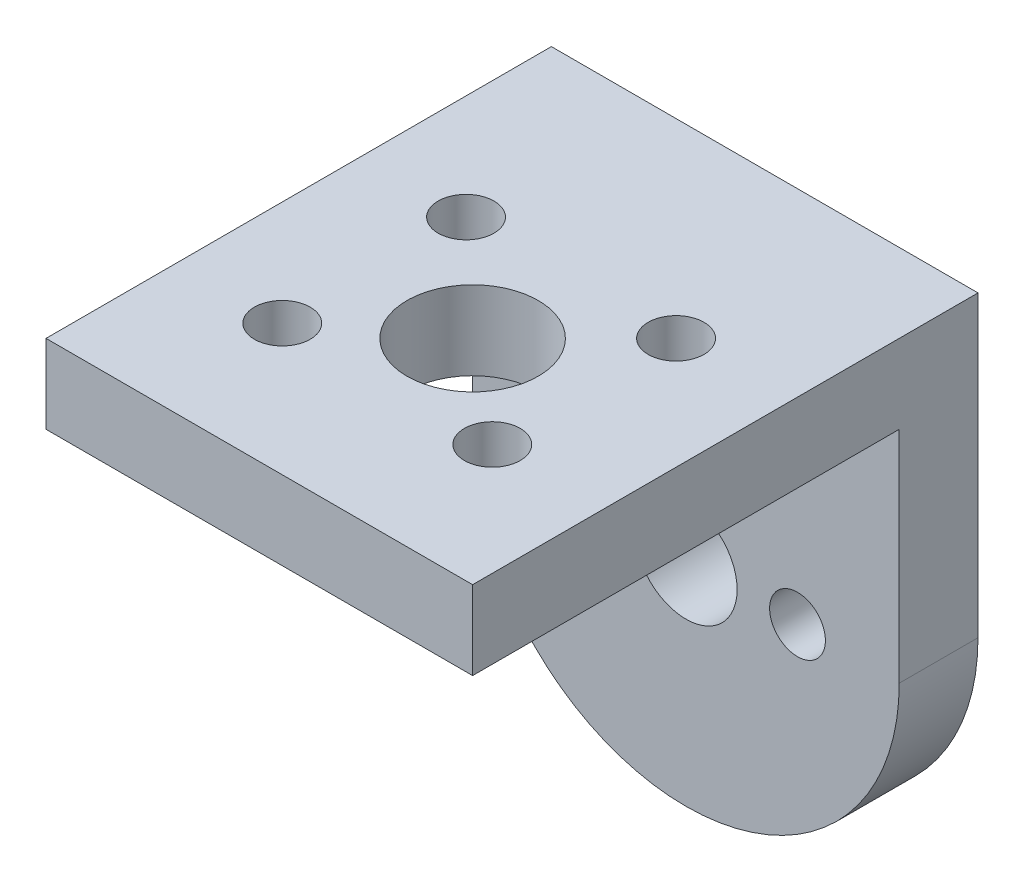
ISO-10303-21;
HEADER;
FILE_DESCRIPTION(('STEP AP214'),'2;1');
FILE_NAME('part.step','',(''),(''),'','','');
FILE_SCHEMA(('AUTOMOTIVE_DESIGN { 1 0 10303 214 1 1 1 1 }'));
ENDSEC;
DATA;
#1=APPLICATION_CONTEXT('core data for automotive mechanical design processes');
#2=APPLICATION_PROTOCOL_DEFINITION('international standard','automotive_design',2000,#1);
#3=PRODUCT_CONTEXT('',#1,'mechanical');
#4=PRODUCT('Part','Part','',(#3));
#5=PRODUCT_RELATED_PRODUCT_CATEGORY('part','',(#4));
#6=PRODUCT_DEFINITION_FORMATION('','',#4);
#7=PRODUCT_DEFINITION_CONTEXT('part definition',#1,'design');
#8=PRODUCT_DEFINITION('design','',#6,#7);
#9=PRODUCT_DEFINITION_SHAPE('','',#8);
#10=(LENGTH_UNIT() NAMED_UNIT(*) SI_UNIT(.MILLI.,.METRE.));
#11=(NAMED_UNIT(*) PLANE_ANGLE_UNIT() SI_UNIT($,.RADIAN.));
#12=(NAMED_UNIT(*) SI_UNIT($,.STERADIAN.) SOLID_ANGLE_UNIT());
#13=UNCERTAINTY_MEASURE_WITH_UNIT(LENGTH_MEASURE(1.E-05),#10,'distance_accuracy_value','');
#14=(GEOMETRIC_REPRESENTATION_CONTEXT(3) GLOBAL_UNCERTAINTY_ASSIGNED_CONTEXT((#13)) GLOBAL_UNIT_ASSIGNED_CONTEXT((#10,
#11,#12)) REPRESENTATION_CONTEXT('',''));
#15=CARTESIAN_POINT('',(0.,0.,0.));
#16=DIRECTION('',(0.,0.,1.));
#17=DIRECTION('',(1.,0.,0.));
#18=AXIS2_PLACEMENT_3D('',#15,#16,#17);
#19=CARTESIAN_POINT('',(0.,-33.,-32.5));
#20=DIRECTION('',(0.,0.,-1.));
#21=DIRECTION('',(-1.,0.,0.));
#22=AXIS2_PLACEMENT_3D('',#19,#20,#21);
#23=PLANE('',#22);
#24=CARTESIAN_POINT('',(7.74999999999999,-16.75,-32.5));
#25=DIRECTION('',(0.,0.,1.));
#26=DIRECTION('',(1.,0.,0.));
#27=AXIS2_PLACEMENT_3D('',#24,#25,#26);
#28=CIRCLE('',#27,2.125);
#29=CARTESIAN_POINT('',(9.87499999999999,-16.75,-32.5));
#30=VERTEX_POINT('',#29);
#31=EDGE_CURVE('E411',#30,#30,#28,.T.);
#32=ORIENTED_EDGE('',*,*,#31,.F.);
#33=EDGE_LOOP('',(#32));
#34=FACE_BOUND('',#33,.T.);
#35=CARTESIAN_POINT('',(24.75,-16.75,-32.5));
#36=DIRECTION('',(0.,0.,1.));
#37=DIRECTION('',(1.,0.,0.));
#38=AXIS2_PLACEMENT_3D('',#35,#36,#37);
#39=CIRCLE('',#38,2.125);
#40=CARTESIAN_POINT('',(26.875,-16.75,-32.5));
#41=VERTEX_POINT('',#40);
#42=EDGE_CURVE('E414',#41,#41,#39,.T.);
#43=ORIENTED_EDGE('',*,*,#42,.F.);
#44=EDGE_LOOP('',(#43));
#45=FACE_BOUND('',#44,.T.);
#46=CARTESIAN_POINT('',(16.25,-16.75,-32.5));
#47=DIRECTION('',(0.,0.,1.));
#48=DIRECTION('',(1.,0.,0.));
#49=AXIS2_PLACEMENT_3D('',#46,#47,#48);
#50=CIRCLE('',#49,3.9);
#51=CARTESIAN_POINT('',(20.15,-16.75,-32.5));
#52=VERTEX_POINT('',#51);
#53=EDGE_CURVE('E141',#52,#52,#50,.T.);
#54=ORIENTED_EDGE('',*,*,#53,.F.);
#55=EDGE_LOOP('',(#54));
#56=FACE_BOUND('',#55,.T.);
#57=DIRECTION('',(0.,1.,0.));
#58=VECTOR('',#57,1.);
#59=CARTESIAN_POINT('',(0.,-33.,-32.5));
#60=LINE('',#59,#58);
#61=CARTESIAN_POINT('',(0.,-16.75,-32.5));
#62=VERTEX_POINT('',#61);
#63=CARTESIAN_POINT('',(0.,0.,-32.5));
#64=VERTEX_POINT('',#63);
#65=EDGE_CURVE('E180',#62,#64,#60,.T.);
#66=ORIENTED_EDGE('',*,*,#65,.F.);
#67=CARTESIAN_POINT('',(16.25,-16.75,-32.5));
#68=DIRECTION('',(0.,0.,1.));
#69=DIRECTION('',(1.,0.,0.));
#70=AXIS2_PLACEMENT_3D('',#67,#68,#69);
#71=CIRCLE('',#70,16.25);
#72=CARTESIAN_POINT('',(32.5,-16.75,-32.5));
#73=VERTEX_POINT('',#72);
#74=EDGE_CURVE('E109',#62,#73,#71,.T.);
#75=ORIENTED_EDGE('',*,*,#74,.T.);
#76=DIRECTION('',(0.,1.,0.));
#77=VECTOR('',#76,1.);
#78=CARTESIAN_POINT('',(32.5,-33.,-32.5));
#79=LINE('',#78,#77);
#80=CARTESIAN_POINT('',(32.5,0.,-32.5));
#81=VERTEX_POINT('',#80);
#82=EDGE_CURVE('E103',#73,#81,#79,.T.);
#83=ORIENTED_EDGE('',*,*,#82,.T.);
#84=DIRECTION('',(-1.,0.,0.));
#85=VECTOR('',#84,1.);
#86=CARTESIAN_POINT('',(0.,0.,-32.5));
#87=LINE('',#86,#85);
#88=EDGE_CURVE('E110',#81,#64,#87,.T.);
#89=ORIENTED_EDGE('',*,*,#88,.T.);
#90=EDGE_LOOP('',(#66,#75,#83,#89));
#91=FACE_BOUND('',#90,.T.);
#92=ADVANCED_FACE('F62',(#34,#45,#56,#91),#23,.F.);
#93=CARTESIAN_POINT('',(0.,-33.,-38.5));
#94=DIRECTION('',(0.,0.,1.));
#95=DIRECTION('',(1.,0.,0.));
#96=AXIS2_PLACEMENT_3D('',#93,#94,#95);
#97=PLANE('',#96);
#98=CARTESIAN_POINT('',(7.74999999999999,-16.75,-38.5));
#99=DIRECTION('',(0.,0.,1.));
#100=DIRECTION('',(1.,0.,0.));
#101=AXIS2_PLACEMENT_3D('',#98,#99,#100);
#102=CIRCLE('',#101,2.125);
#103=CARTESIAN_POINT('',(9.87499999999999,-16.75,-38.5));
#104=VERTEX_POINT('',#103);
#105=EDGE_CURVE('E67',#104,#104,#102,.T.);
#106=ORIENTED_EDGE('',*,*,#105,.T.);
#107=EDGE_LOOP('',(#106));
#108=FACE_BOUND('',#107,.T.);
#109=CARTESIAN_POINT('',(24.75,-16.75,-38.5));
#110=DIRECTION('',(0.,0.,1.));
#111=DIRECTION('',(1.,0.,0.));
#112=AXIS2_PLACEMENT_3D('',#109,#110,#111);
#113=CIRCLE('',#112,2.125);
#114=CARTESIAN_POINT('',(26.875,-16.75,-38.5));
#115=VERTEX_POINT('',#114);
#116=EDGE_CURVE('E142',#115,#115,#113,.T.);
#117=ORIENTED_EDGE('',*,*,#116,.T.);
#118=EDGE_LOOP('',(#117));
#119=FACE_BOUND('',#118,.T.);
#120=CARTESIAN_POINT('',(16.25,-16.75,-38.5));
#121=DIRECTION('',(0.,0.,1.));
#122=DIRECTION('',(1.,0.,0.));
#123=AXIS2_PLACEMENT_3D('',#120,#121,#122);
#124=CIRCLE('',#123,3.9);
#125=CARTESIAN_POINT('',(20.15,-16.75,-38.5));
#126=VERTEX_POINT('',#125);
#127=EDGE_CURVE('E137',#126,#126,#124,.T.);
#128=ORIENTED_EDGE('',*,*,#127,.T.);
#129=EDGE_LOOP('',(#128));
#130=FACE_BOUND('',#129,.T.);
#131=CARTESIAN_POINT('',(16.25,-16.75,-38.5));
#132=DIRECTION('',(0.,0.,1.));
#133=DIRECTION('',(1.,0.,0.));
#134=AXIS2_PLACEMENT_3D('',#131,#132,#133);
#135=CIRCLE('',#134,16.25);
#136=CARTESIAN_POINT('',(0.,-16.75,-38.5));
#137=VERTEX_POINT('',#136);
#138=CARTESIAN_POINT('',(32.5,-16.75,-38.5));
#139=VERTEX_POINT('',#138);
#140=EDGE_CURVE('E168',#137,#139,#135,.T.);
#141=ORIENTED_EDGE('',*,*,#140,.F.);
#142=DIRECTION('',(0.,1.,0.));
#143=VECTOR('',#142,1.);
#144=CARTESIAN_POINT('',(0.,-33.,-38.5));
#145=LINE('',#144,#143);
#146=CARTESIAN_POINT('',(0.,6.,-38.5));
#147=VERTEX_POINT('',#146);
#148=EDGE_CURVE('E182',#137,#147,#145,.T.);
#149=ORIENTED_EDGE('',*,*,#148,.T.);
#150=DIRECTION('',(1.,0.,0.));
#151=VECTOR('',#150,1.);
#152=CARTESIAN_POINT('',(0.,6.,-38.5));
#153=LINE('',#152,#151);
#154=CARTESIAN_POINT('',(32.5,6.,-38.5));
#155=VERTEX_POINT('',#154);
#156=EDGE_CURVE('E113',#147,#155,#153,.T.);
#157=ORIENTED_EDGE('',*,*,#156,.T.);
#158=DIRECTION('',(0.,1.,0.));
#159=VECTOR('',#158,1.);
#160=CARTESIAN_POINT('',(32.5,-33.,-38.5));
#161=LINE('',#160,#159);
#162=EDGE_CURVE('E111',#139,#155,#161,.T.);
#163=ORIENTED_EDGE('',*,*,#162,.F.);
#164=EDGE_LOOP('',(#141,#149,#157,#163));
#165=FACE_BOUND('',#164,.T.);
#166=ADVANCED_FACE('F246',(#108,#119,#130,#165),#97,.F.);
#167=CARTESIAN_POINT('',(32.5,6.,0.));
#168=DIRECTION('',(-1.,0.,0.));
#169=DIRECTION('',(0.,0.,1.));
#170=AXIS2_PLACEMENT_3D('',#167,#168,#169);
#171=PLANE('',#170);
#172=DIRECTION('',(0.,0.,1.));
#173=VECTOR('',#172,1.);
#174=CARTESIAN_POINT('',(32.5,-16.75,-71.5));
#175=LINE('',#174,#173);
#176=EDGE_CURVE('E165',#139,#73,#175,.T.);
#177=ORIENTED_EDGE('',*,*,#176,.F.);
#178=ORIENTED_EDGE('',*,*,#162,.T.);
#179=DIRECTION('',(0.,0.,-1.));
#180=VECTOR('',#179,1.);
#181=CARTESIAN_POINT('',(32.5,6.,0.));
#182=LINE('',#181,#180);
#183=CARTESIAN_POINT('',(32.5,6.,0.));
#184=VERTEX_POINT('',#183);
#185=EDGE_CURVE('E140',#184,#155,#182,.T.);
#186=ORIENTED_EDGE('',*,*,#185,.F.);
#187=DIRECTION('',(0.,-1.,0.));
#188=VECTOR('',#187,1.);
#189=CARTESIAN_POINT('',(32.5,6.,0.));
#190=LINE('',#189,#188);
#191=CARTESIAN_POINT('',(32.5,0.,0.));
#192=VERTEX_POINT('',#191);
#193=EDGE_CURVE('E79',#184,#192,#190,.T.);
#194=ORIENTED_EDGE('',*,*,#193,.T.);
#195=DIRECTION('',(0.,0.,-1.));
#196=VECTOR('',#195,1.);
#197=CARTESIAN_POINT('',(32.5,0.,0.));
#198=LINE('',#197,#196);
#199=EDGE_CURVE('E120',#192,#81,#198,.T.);
#200=ORIENTED_EDGE('',*,*,#199,.T.);
#201=ORIENTED_EDGE('',*,*,#82,.F.);
#202=EDGE_LOOP('',(#177,#178,#186,#194,#200,#201));
#203=FACE_BOUND('',#202,.T.);
#204=ADVANCED_FACE('F118',(#203),#171,.F.);
#205=CARTESIAN_POINT('',(0.,6.,0.));
#206=DIRECTION('',(0.,-1.,0.));
#207=DIRECTION('',(0.,0.,-1.));
#208=AXIS2_PLACEMENT_3D('',#205,#206,#207);
#209=PLANE('',#208);
#210=DIRECTION('',(0.,0.,1.));
#211=VECTOR('',#210,1.);
#212=CARTESIAN_POINT('',(0.,6.,0.));
#213=LINE('',#212,#211);
#214=CARTESIAN_POINT('',(0.,6.,0.));
#215=VERTEX_POINT('',#214);
#216=EDGE_CURVE('E128',#147,#215,#213,.T.);
#217=ORIENTED_EDGE('',*,*,#216,.T.);
#218=DIRECTION('',(1.,0.,0.));
#219=VECTOR('',#218,1.);
#220=CARTESIAN_POINT('',(0.,6.,0.));
#221=LINE('',#220,#219);
#222=EDGE_CURVE('E84',#215,#184,#221,.T.);
#223=ORIENTED_EDGE('',*,*,#222,.T.);
#224=ORIENTED_EDGE('',*,*,#185,.T.);
#225=ORIENTED_EDGE('',*,*,#156,.F.);
#226=EDGE_LOOP('',(#217,#223,#224,#225));
#227=FACE_BOUND('',#226,.T.);
#228=CARTESIAN_POINT('',(24.,6.,-10.));
#229=DIRECTION('',(0.,1.,0.));
#230=DIRECTION('',(0.,0.,1.));
#231=AXIS2_PLACEMENT_3D('',#228,#229,#230);
#232=CIRCLE('',#231,2.125);
#233=CARTESIAN_POINT('',(24.,6.,-7.875));
#234=VERTEX_POINT('',#233);
#235=EDGE_CURVE('E219',#234,#234,#232,.T.);
#236=ORIENTED_EDGE('',*,*,#235,.F.);
#237=EDGE_LOOP('',(#236));
#238=FACE_BOUND('',#237,.T.);
#239=CARTESIAN_POINT('',(24.,6.,-24.));
#240=DIRECTION('',(0.,1.,0.));
#241=DIRECTION('',(0.,0.,1.));
#242=AXIS2_PLACEMENT_3D('',#239,#240,#241);
#243=CIRCLE('',#242,2.125);
#244=CARTESIAN_POINT('',(24.,6.,-21.875));
#245=VERTEX_POINT('',#244);
#246=EDGE_CURVE('E215',#245,#245,#243,.T.);
#247=ORIENTED_EDGE('',*,*,#246,.F.);
#248=EDGE_LOOP('',(#247));
#249=FACE_BOUND('',#248,.T.);
#250=CARTESIAN_POINT('',(8.,6.,-24.));
#251=DIRECTION('',(0.,1.,0.));
#252=DIRECTION('',(0.,0.,1.));
#253=AXIS2_PLACEMENT_3D('',#250,#251,#252);
#254=CIRCLE('',#253,2.125);
#255=CARTESIAN_POINT('',(8.,6.,-21.875));
#256=VERTEX_POINT('',#255);
#257=EDGE_CURVE('E204',#256,#256,#254,.T.);
#258=ORIENTED_EDGE('',*,*,#257,.F.);
#259=EDGE_LOOP('',(#258));
#260=FACE_BOUND('',#259,.T.);
#261=CARTESIAN_POINT('',(8.,6.,-10.));
#262=DIRECTION('',(0.,1.,0.));
#263=DIRECTION('',(0.,0.,1.));
#264=AXIS2_PLACEMENT_3D('',#261,#262,#263);
#265=CIRCLE('',#264,2.125);
#266=CARTESIAN_POINT('',(8.,6.,-7.875));
#267=VERTEX_POINT('',#266);
#268=EDGE_CURVE('E198',#267,#267,#265,.T.);
#269=ORIENTED_EDGE('',*,*,#268,.F.);
#270=EDGE_LOOP('',(#269));
#271=FACE_BOUND('',#270,.T.);
#272=CARTESIAN_POINT('',(16.25,6.,-16.25));
#273=DIRECTION('',(0.,1.,0.));
#274=DIRECTION('',(0.,0.,1.));
#275=AXIS2_PLACEMENT_3D('',#272,#273,#274);
#276=CIRCLE('',#275,5.);
#277=CARTESIAN_POINT('',(16.25,6.,-11.25));
#278=VERTEX_POINT('',#277);
#279=EDGE_CURVE('E190',#278,#278,#276,.T.);
#280=ORIENTED_EDGE('',*,*,#279,.F.);
#281=EDGE_LOOP('',(#280));
#282=FACE_BOUND('',#281,.T.);
#283=ADVANCED_FACE('F253',(#227,#238,#249,#260,#271,#282),#209,.F.);
#284=CARTESIAN_POINT('',(0.,0.,0.));
#285=DIRECTION('',(0.,-1.,0.));
#286=DIRECTION('',(0.,0.,-1.));
#287=AXIS2_PLACEMENT_3D('',#284,#285,#286);
#288=PLANE('',#287);
#289=CARTESIAN_POINT('',(8.,0.,-10.));
#290=DIRECTION('',(0.,1.,0.));
#291=DIRECTION('',(0.,0.,1.));
#292=AXIS2_PLACEMENT_3D('',#289,#290,#291);
#293=CIRCLE('',#292,2.125);
#294=CARTESIAN_POINT('',(8.,0.,-7.875));
#295=VERTEX_POINT('',#294);
#296=EDGE_CURVE('E195',#295,#295,#293,.T.);
#297=ORIENTED_EDGE('',*,*,#296,.T.);
#298=EDGE_LOOP('',(#297));
#299=FACE_BOUND('',#298,.T.);
#300=CARTESIAN_POINT('',(24.,0.,-24.));
#301=DIRECTION('',(0.,1.,0.));
#302=DIRECTION('',(0.,0.,1.));
#303=AXIS2_PLACEMENT_3D('',#300,#301,#302);
#304=CIRCLE('',#303,2.125);
#305=CARTESIAN_POINT('',(24.,0.,-21.875));
#306=VERTEX_POINT('',#305);
#307=EDGE_CURVE('E208',#306,#306,#304,.T.);
#308=ORIENTED_EDGE('',*,*,#307,.T.);
#309=EDGE_LOOP('',(#308));
#310=FACE_BOUND('',#309,.T.);
#311=DIRECTION('',(0.,0.,1.));
#312=VECTOR('',#311,1.);
#313=CARTESIAN_POINT('',(0.,0.,0.));
#314=LINE('',#313,#312);
#315=CARTESIAN_POINT('',(0.,0.,0.));
#316=VERTEX_POINT('',#315);
#317=EDGE_CURVE('E126',#64,#316,#314,.T.);
#318=ORIENTED_EDGE('',*,*,#317,.F.);
#319=ORIENTED_EDGE('',*,*,#88,.F.);
#320=ORIENTED_EDGE('',*,*,#199,.F.);
#321=DIRECTION('',(1.,0.,0.));
#322=VECTOR('',#321,1.);
#323=CARTESIAN_POINT('',(0.,0.,0.));
#324=LINE('',#323,#322);
#325=EDGE_CURVE('E96',#316,#192,#324,.T.);
#326=ORIENTED_EDGE('',*,*,#325,.F.);
#327=EDGE_LOOP('',(#318,#319,#320,#326));
#328=FACE_BOUND('',#327,.T.);
#329=CARTESIAN_POINT('',(24.,0.,-10.));
#330=DIRECTION('',(0.,1.,0.));
#331=DIRECTION('',(0.,0.,1.));
#332=AXIS2_PLACEMENT_3D('',#329,#330,#331);
#333=CIRCLE('',#332,2.125);
#334=CARTESIAN_POINT('',(24.,0.,-7.875));
#335=VERTEX_POINT('',#334);
#336=EDGE_CURVE('E216',#335,#335,#333,.T.);
#337=ORIENTED_EDGE('',*,*,#336,.T.);
#338=EDGE_LOOP('',(#337));
#339=FACE_BOUND('',#338,.T.);
#340=CARTESIAN_POINT('',(8.,0.,-24.));
#341=DIRECTION('',(0.,1.,0.));
#342=DIRECTION('',(0.,0.,1.));
#343=AXIS2_PLACEMENT_3D('',#340,#341,#342);
#344=CIRCLE('',#343,2.125);
#345=CARTESIAN_POINT('',(8.,0.,-21.875));
#346=VERTEX_POINT('',#345);
#347=EDGE_CURVE('E199',#346,#346,#344,.T.);
#348=ORIENTED_EDGE('',*,*,#347,.T.);
#349=EDGE_LOOP('',(#348));
#350=FACE_BOUND('',#349,.T.);
#351=CARTESIAN_POINT('',(16.25,0.,-16.25));
#352=DIRECTION('',(0.,1.,0.));
#353=DIRECTION('',(0.,0.,1.));
#354=AXIS2_PLACEMENT_3D('',#351,#352,#353);
#355=CIRCLE('',#354,5.);
#356=CARTESIAN_POINT('',(16.25,0.,-11.25));
#357=VERTEX_POINT('',#356);
#358=EDGE_CURVE('E179',#357,#357,#355,.T.);
#359=ORIENTED_EDGE('',*,*,#358,.T.);
#360=EDGE_LOOP('',(#359));
#361=FACE_BOUND('',#360,.T.);
#362=ADVANCED_FACE('F124',(#299,#310,#328,#339,#350,#361),#288,.T.);
#363=CARTESIAN_POINT('',(0.,6.,0.));
#364=DIRECTION('',(1.,0.,0.));
#365=DIRECTION('',(0.,0.,-1.));
#366=AXIS2_PLACEMENT_3D('',#363,#364,#365);
#367=PLANE('',#366);
#368=ORIENTED_EDGE('',*,*,#148,.F.);
#369=DIRECTION('',(0.,0.,1.));
#370=VECTOR('',#369,1.);
#371=CARTESIAN_POINT('',(0.,-16.75,-71.5));
#372=LINE('',#371,#370);
#373=EDGE_CURVE('E147',#137,#62,#372,.T.);
#374=ORIENTED_EDGE('',*,*,#373,.T.);
#375=ORIENTED_EDGE('',*,*,#65,.T.);
#376=ORIENTED_EDGE('',*,*,#317,.T.);
#377=DIRECTION('',(0.,-1.,0.));
#378=VECTOR('',#377,1.);
#379=CARTESIAN_POINT('',(0.,6.,0.));
#380=LINE('',#379,#378);
#381=EDGE_CURVE('E12',#215,#316,#380,.T.);
#382=ORIENTED_EDGE('',*,*,#381,.F.);
#383=ORIENTED_EDGE('',*,*,#216,.F.);
#384=EDGE_LOOP('',(#368,#374,#375,#376,#382,#383));
#385=FACE_BOUND('',#384,.T.);
#386=ADVANCED_FACE('F70',(#385),#367,.F.);
#387=CARTESIAN_POINT('',(0.,6.,0.));
#388=DIRECTION('',(0.,0.,-1.));
#389=DIRECTION('',(-1.,0.,0.));
#390=AXIS2_PLACEMENT_3D('',#387,#388,#389);
#391=PLANE('',#390);
#392=ORIENTED_EDGE('',*,*,#325,.T.);
#393=ORIENTED_EDGE('',*,*,#193,.F.);
#394=ORIENTED_EDGE('',*,*,#222,.F.);
#395=ORIENTED_EDGE('',*,*,#381,.T.);
#396=EDGE_LOOP('',(#392,#393,#394,#395));
#397=FACE_BOUND('',#396,.T.);
#398=ADVANCED_FACE('F291',(#397),#391,.F.);
#399=CARTESIAN_POINT('',(24.,6.,-10.));
#400=DIRECTION('',(0.,-1.,0.));
#401=DIRECTION('',(0.,0.,-1.));
#402=AXIS2_PLACEMENT_3D('',#399,#400,#401);
#403=CYLINDRICAL_SURFACE('',#402,2.125);
#404=ORIENTED_EDGE('',*,*,#235,.T.);
#405=EDGE_LOOP('',(#404));
#406=FACE_BOUND('',#405,.T.);
#407=ORIENTED_EDGE('',*,*,#336,.F.);
#408=EDGE_LOOP('',(#407));
#409=FACE_BOUND('',#408,.T.);
#410=ADVANCED_FACE('F287',(#406,#409),#403,.F.);
#411=CARTESIAN_POINT('',(24.,6.,-24.));
#412=DIRECTION('',(0.,-1.,0.));
#413=DIRECTION('',(0.,0.,-1.));
#414=AXIS2_PLACEMENT_3D('',#411,#412,#413);
#415=CYLINDRICAL_SURFACE('',#414,2.125);
#416=ORIENTED_EDGE('',*,*,#246,.T.);
#417=EDGE_LOOP('',(#416));
#418=FACE_BOUND('',#417,.T.);
#419=ORIENTED_EDGE('',*,*,#307,.F.);
#420=EDGE_LOOP('',(#419));
#421=FACE_BOUND('',#420,.T.);
#422=ADVANCED_FACE('F282',(#418,#421),#415,.F.);
#423=CARTESIAN_POINT('',(8.,6.,-24.));
#424=DIRECTION('',(0.,-1.,0.));
#425=DIRECTION('',(0.,0.,-1.));
#426=AXIS2_PLACEMENT_3D('',#423,#424,#425);
#427=CYLINDRICAL_SURFACE('',#426,2.125);
#428=ORIENTED_EDGE('',*,*,#257,.T.);
#429=EDGE_LOOP('',(#428));
#430=FACE_BOUND('',#429,.T.);
#431=ORIENTED_EDGE('',*,*,#347,.F.);
#432=EDGE_LOOP('',(#431));
#433=FACE_BOUND('',#432,.T.);
#434=ADVANCED_FACE('F284',(#430,#433),#427,.F.);
#435=CARTESIAN_POINT('',(8.,6.,-10.));
#436=DIRECTION('',(0.,-1.,0.));
#437=DIRECTION('',(0.,0.,-1.));
#438=AXIS2_PLACEMENT_3D('',#435,#436,#437);
#439=CYLINDRICAL_SURFACE('',#438,2.125);
#440=ORIENTED_EDGE('',*,*,#268,.T.);
#441=EDGE_LOOP('',(#440));
#442=FACE_BOUND('',#441,.T.);
#443=ORIENTED_EDGE('',*,*,#296,.F.);
#444=EDGE_LOOP('',(#443));
#445=FACE_BOUND('',#444,.T.);
#446=ADVANCED_FACE('F270',(#442,#445),#439,.F.);
#447=CARTESIAN_POINT('',(16.25,6.,-16.25));
#448=DIRECTION('',(0.,-1.,0.));
#449=DIRECTION('',(0.,0.,-1.));
#450=AXIS2_PLACEMENT_3D('',#447,#448,#449);
#451=CYLINDRICAL_SURFACE('',#450,5.);
#452=ORIENTED_EDGE('',*,*,#279,.T.);
#453=EDGE_LOOP('',(#452));
#454=FACE_BOUND('',#453,.T.);
#455=ORIENTED_EDGE('',*,*,#358,.F.);
#456=EDGE_LOOP('',(#455));
#457=FACE_BOUND('',#456,.T.);
#458=ADVANCED_FACE('F258',(#454,#457),#451,.F.);
#459=CARTESIAN_POINT('',(16.25,-16.75,-71.5));
#460=DIRECTION('',(0.,0.,1.));
#461=DIRECTION('',(1.,0.,0.));
#462=AXIS2_PLACEMENT_3D('',#459,#460,#461);
#463=CYLINDRICAL_SURFACE('',#462,16.25);
#464=ORIENTED_EDGE('',*,*,#140,.T.);
#465=ORIENTED_EDGE('',*,*,#176,.T.);
#466=ORIENTED_EDGE('',*,*,#74,.F.);
#467=ORIENTED_EDGE('',*,*,#373,.F.);
#468=EDGE_LOOP('',(#464,#465,#466,#467));
#469=FACE_BOUND('',#468,.T.);
#470=ADVANCED_FACE('F251',(#469),#463,.T.);
#471=CARTESIAN_POINT('',(16.25,-16.75,-71.5));
#472=DIRECTION('',(0.,0.,1.));
#473=DIRECTION('',(1.,0.,0.));
#474=AXIS2_PLACEMENT_3D('',#471,#472,#473);
#475=CYLINDRICAL_SURFACE('',#474,3.9);
#476=ORIENTED_EDGE('',*,*,#53,.T.);
#477=EDGE_LOOP('',(#476));
#478=FACE_BOUND('',#477,.T.);
#479=ORIENTED_EDGE('',*,*,#127,.F.);
#480=EDGE_LOOP('',(#479));
#481=FACE_BOUND('',#480,.T.);
#482=ADVANCED_FACE('F254',(#478,#481),#475,.F.);
#483=CARTESIAN_POINT('',(24.75,-16.75,-71.5));
#484=DIRECTION('',(0.,0.,1.));
#485=DIRECTION('',(1.,0.,0.));
#486=AXIS2_PLACEMENT_3D('',#483,#484,#485);
#487=CYLINDRICAL_SURFACE('',#486,2.125);
#488=ORIENTED_EDGE('',*,*,#42,.T.);
#489=EDGE_LOOP('',(#488));
#490=FACE_BOUND('',#489,.T.);
#491=ORIENTED_EDGE('',*,*,#116,.F.);
#492=EDGE_LOOP('',(#491));
#493=FACE_BOUND('',#492,.T.);
#494=ADVANCED_FACE('F263',(#490,#493),#487,.F.);
#495=CARTESIAN_POINT('',(7.74999999999999,-16.75,-71.5));
#496=DIRECTION('',(0.,0.,1.));
#497=DIRECTION('',(1.,0.,0.));
#498=AXIS2_PLACEMENT_3D('',#495,#496,#497);
#499=CYLINDRICAL_SURFACE('',#498,2.125);
#500=ORIENTED_EDGE('',*,*,#31,.T.);
#501=EDGE_LOOP('',(#500));
#502=FACE_BOUND('',#501,.T.);
#503=ORIENTED_EDGE('',*,*,#105,.F.);
#504=EDGE_LOOP('',(#503));
#505=FACE_BOUND('',#504,.T.);
#506=ADVANCED_FACE('F392',(#502,#505),#499,.F.);
#507=CLOSED_SHELL('',(#92,#166,#204,#283,#362,#386,#398,#410,#422,#434,#446,#458,#470,#482,#494,#506));
#508=MANIFOLD_SOLID_BREP('B2',#507);
#509=ADVANCED_BREP_SHAPE_REPRESENTATION('',(#18,#508),#14);
#510=SHAPE_DEFINITION_REPRESENTATION(#9,#509);
ENDSEC;
END-ISO-10303-21;
